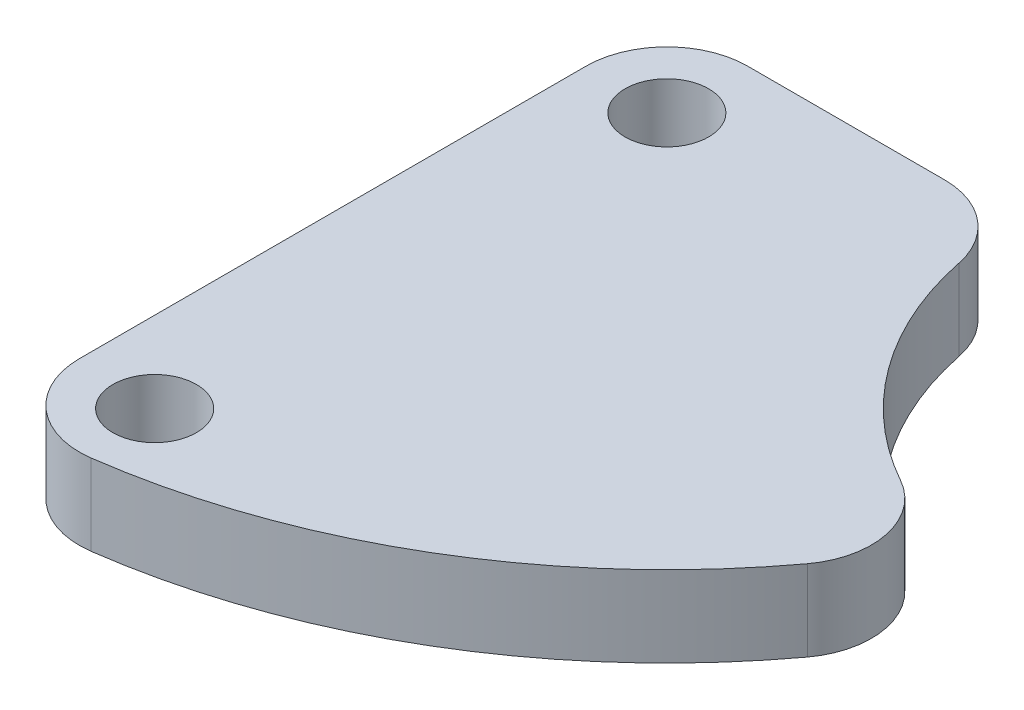
ISO-10303-21;
HEADER;
FILE_DESCRIPTION(('STEP AP214'),'2;1');
FILE_NAME('part.step','',(''),(''),'','','');
FILE_SCHEMA(('AUTOMOTIVE_DESIGN { 1 0 10303 214 1 1 1 1 }'));
ENDSEC;
DATA;
#1=APPLICATION_CONTEXT('core data for automotive mechanical design processes');
#2=APPLICATION_PROTOCOL_DEFINITION('international standard','automotive_design',2000,#1);
#3=PRODUCT_CONTEXT('',#1,'mechanical');
#4=PRODUCT('Part','Part','',(#3));
#5=PRODUCT_RELATED_PRODUCT_CATEGORY('part','',(#4));
#6=PRODUCT_DEFINITION_FORMATION('','',#4);
#7=PRODUCT_DEFINITION_CONTEXT('part definition',#1,'design');
#8=PRODUCT_DEFINITION('design','',#6,#7);
#9=PRODUCT_DEFINITION_SHAPE('','',#8);
#10=(LENGTH_UNIT() NAMED_UNIT(*) SI_UNIT(.MILLI.,.METRE.));
#11=(NAMED_UNIT(*) PLANE_ANGLE_UNIT() SI_UNIT($,.RADIAN.));
#12=(NAMED_UNIT(*) SI_UNIT($,.STERADIAN.) SOLID_ANGLE_UNIT());
#13=UNCERTAINTY_MEASURE_WITH_UNIT(LENGTH_MEASURE(1.E-05),#10,'distance_accuracy_value','');
#14=(GEOMETRIC_REPRESENTATION_CONTEXT(3) GLOBAL_UNCERTAINTY_ASSIGNED_CONTEXT((#13)) GLOBAL_UNIT_ASSIGNED_CONTEXT((#10,
#11,#12)) REPRESENTATION_CONTEXT('',''));
#15=CARTESIAN_POINT('',(0.,0.,0.));
#16=DIRECTION('',(0.,0.,1.));
#17=DIRECTION('',(1.,0.,0.));
#18=AXIS2_PLACEMENT_3D('',#15,#16,#17);
#19=CARTESIAN_POINT('',(-12.5,-3.,12.5));
#20=DIRECTION('',(-1.,0.,0.));
#21=DIRECTION('',(0.,0.,1.));
#22=AXIS2_PLACEMENT_3D('',#19,#20,#21);
#23=PLANE('',#22);
#24=DIRECTION('',(0.,0.,1.));
#25=VECTOR('',#24,1.);
#26=CARTESIAN_POINT('',(-12.5,-3.,12.5));
#27=LINE('',#26,#25);
#28=CARTESIAN_POINT('',(-12.5,-3.,-9.49999999999999));
#29=VERTEX_POINT('',#28);
#30=CARTESIAN_POINT('',(-12.5,-3.,9.29449471770337));
#31=VERTEX_POINT('',#30);
#32=EDGE_CURVE('E110',#29,#31,#27,.T.);
#33=ORIENTED_EDGE('',*,*,#32,.T.);
#34=DIRECTION('',(0.,1.,0.));
#35=VECTOR('',#34,1.);
#36=CARTESIAN_POINT('',(-12.5,-3.,9.29449471770337));
#37=LINE('',#36,#35);
#38=CARTESIAN_POINT('',(-12.5,0.,9.29449471770337));
#39=VERTEX_POINT('',#38);
#40=EDGE_CURVE('E138',#31,#39,#37,.T.);
#41=ORIENTED_EDGE('',*,*,#40,.T.);
#42=DIRECTION('',(0.,0.,1.));
#43=VECTOR('',#42,1.);
#44=CARTESIAN_POINT('',(-12.5,0.,12.5));
#45=LINE('',#44,#43);
#46=CARTESIAN_POINT('',(-12.5,0.,-9.49999999999999));
#47=VERTEX_POINT('',#46);
#48=EDGE_CURVE('E223',#47,#39,#45,.T.);
#49=ORIENTED_EDGE('',*,*,#48,.F.);
#50=DIRECTION('',(0.,1.,0.));
#51=VECTOR('',#50,1.);
#52=CARTESIAN_POINT('',(-12.5,-3.,-9.5));
#53=LINE('',#52,#51);
#54=EDGE_CURVE('E136',#47,#29,#53,.F.);
#55=ORIENTED_EDGE('',*,*,#54,.T.);
#56=EDGE_LOOP('',(#33,#41,#49,#55));
#57=FACE_BOUND('',#56,.T.);
#58=ADVANCED_FACE('F33',(#57),#23,.T.);
#59=CARTESIAN_POINT('',(-12.5,-3.,-12.5));
#60=DIRECTION('',(0.,0.,-1.));
#61=DIRECTION('',(-1.,0.,0.));
#62=AXIS2_PLACEMENT_3D('',#59,#60,#61);
#63=PLANE('',#62);
#64=DIRECTION('',(-1.,0.,0.));
#65=VECTOR('',#64,1.);
#66=CARTESIAN_POINT('',(-12.5,-3.,-12.5));
#67=LINE('',#66,#65);
#68=CARTESIAN_POINT('',(-2.19693845669907,-3.,-12.5));
#69=VERTEX_POINT('',#68);
#70=CARTESIAN_POINT('',(-9.5,-3.,-12.5));
#71=VERTEX_POINT('',#70);
#72=EDGE_CURVE('E154',#69,#71,#67,.T.);
#73=ORIENTED_EDGE('',*,*,#72,.T.);
#74=DIRECTION('',(0.,1.,0.));
#75=VECTOR('',#74,1.);
#76=CARTESIAN_POINT('',(-9.5,-3.,-12.5));
#77=LINE('',#76,#75);
#78=CARTESIAN_POINT('',(-9.5,0.,-12.5));
#79=VERTEX_POINT('',#78);
#80=EDGE_CURVE('E11',#71,#79,#77,.T.);
#81=ORIENTED_EDGE('',*,*,#80,.T.);
#82=DIRECTION('',(-1.,0.,0.));
#83=VECTOR('',#82,1.);
#84=CARTESIAN_POINT('',(-12.5,0.,-12.5));
#85=LINE('',#84,#83);
#86=CARTESIAN_POINT('',(-2.19693845669907,0.,-12.5));
#87=VERTEX_POINT('',#86);
#88=EDGE_CURVE('E217',#87,#79,#85,.T.);
#89=ORIENTED_EDGE('',*,*,#88,.F.);
#90=DIRECTION('',(0.,-1.,0.));
#91=VECTOR('',#90,1.);
#92=CARTESIAN_POINT('',(-2.19693845669907,-3.,-12.5));
#93=LINE('',#92,#91);
#94=EDGE_CURVE('E134',#87,#69,#93,.T.);
#95=ORIENTED_EDGE('',*,*,#94,.T.);
#96=EDGE_LOOP('',(#73,#81,#89,#95));
#97=FACE_BOUND('',#96,.T.);
#98=ADVANCED_FACE('F167',(#97),#63,.T.);
#99=CARTESIAN_POINT('',(0.,-3.,0.));
#100=DIRECTION('',(0.,-1.,0.));
#101=DIRECTION('',(0.,0.,-1.));
#102=AXIS2_PLACEMENT_3D('',#99,#100,#101);
#103=PLANE('',#102);
#104=CARTESIAN_POINT('',(-12.5,-3.,-12.5));
#105=DIRECTION('',(0.,-1.,0.));
#106=DIRECTION('',(0.,0.,-1.));
#107=AXIS2_PLACEMENT_3D('',#104,#105,#106);
#108=CIRCLE('',#107,25.);
#109=CARTESIAN_POINT('',(7.59090909090909,-3.,2.37801639671185));
#110=VERTEX_POINT('',#109);
#111=CARTESIAN_POINT('',(-9.09090909090909,-3.,12.2664712701175));
#112=VERTEX_POINT('',#111);
#113=EDGE_CURVE('E109',#110,#112,#108,.T.);
#114=ORIENTED_EDGE('',*,*,#113,.T.);
#115=CARTESIAN_POINT('',(-9.5,-3.,9.29449471770337));
#116=DIRECTION('',(0.,-1.,0.));
#117=DIRECTION('',(0.,0.,-1.));
#118=AXIS2_PLACEMENT_3D('',#115,#116,#117);
#119=CIRCLE('',#118,3.);
#120=EDGE_CURVE('E41',#112,#31,#119,.T.);
#121=ORIENTED_EDGE('',*,*,#120,.T.);
#122=ORIENTED_EDGE('',*,*,#32,.F.);
#123=CARTESIAN_POINT('',(-9.5,-3.,-9.5));
#124=DIRECTION('',(0.,-1.,0.));
#125=DIRECTION('',(0.,0.,-1.));
#126=AXIS2_PLACEMENT_3D('',#123,#124,#125);
#127=CIRCLE('',#126,3.);
#128=EDGE_CURVE('E48',#29,#71,#127,.T.);
#129=ORIENTED_EDGE('',*,*,#128,.T.);
#130=ORIENTED_EDGE('',*,*,#72,.F.);
#131=CARTESIAN_POINT('',(-2.19693845669907,-3.,-9.5));
#132=DIRECTION('',(0.,-1.,0.));
#133=DIRECTION('',(0.,0.,-1.));
#134=AXIS2_PLACEMENT_3D('',#131,#132,#133);
#135=CIRCLE('',#134,3.);
#136=CARTESIAN_POINT('',(0.742449234640747,-3.,-10.1));
#137=VERTEX_POINT('',#136);
#138=EDGE_CURVE('E130',#69,#137,#135,.T.);
#139=ORIENTED_EDGE('',*,*,#138,.T.);
#140=CARTESIAN_POINT('',(12.5,-3.,-12.5));
#141=DIRECTION('',(0.,1.,0.));
#142=DIRECTION('',(0.,0.,1.));
#143=AXIS2_PLACEMENT_3D('',#140,#141,#142);
#144=CIRCLE('',#143,12.);
#145=CARTESIAN_POINT('',(6.644,-3.,-2.02587645671486));
#146=VERTEX_POINT('',#145);
#147=EDGE_CURVE('E235',#137,#146,#144,.T.);
#148=ORIENTED_EDGE('',*,*,#147,.T.);
#149=CARTESIAN_POINT('',(5.18,-3.,0.592654429106426));
#150=DIRECTION('',(0.,-1.,0.));
#151=DIRECTION('',(0.,0.,-1.));
#152=AXIS2_PLACEMENT_3D('',#149,#150,#151);
#153=CIRCLE('',#152,3.);
#154=EDGE_CURVE('E132',#146,#110,#153,.T.);
#155=ORIENTED_EDGE('',*,*,#154,.T.);
#156=EDGE_LOOP('',(#114,#121,#122,#129,#130,#139,#148,#155));
#157=FACE_BOUND('',#156,.T.);
#158=CARTESIAN_POINT('',(-9.4999999999998,-3.,9.5));
#159=DIRECTION('',(0.,1.,0.));
#160=DIRECTION('',(0.,0.,1.));
#161=AXIS2_PLACEMENT_3D('',#158,#159,#160);
#162=CIRCLE('',#161,1.55);
#163=CARTESIAN_POINT('',(-9.4999999999998,-3.,11.05));
#164=VERTEX_POINT('',#163);
#165=EDGE_CURVE('E214',#164,#164,#162,.T.);
#166=ORIENTED_EDGE('',*,*,#165,.T.);
#167=EDGE_LOOP('',(#166));
#168=FACE_BOUND('',#167,.T.);
#169=CARTESIAN_POINT('',(-9.5,-3.,-9.5));
#170=DIRECTION('',(0.,1.,0.));
#171=DIRECTION('',(0.,0.,1.));
#172=AXIS2_PLACEMENT_3D('',#169,#170,#171);
#173=CIRCLE('',#172,1.55);
#174=CARTESIAN_POINT('',(-9.5,-3.,-7.95));
#175=VERTEX_POINT('',#174);
#176=EDGE_CURVE('E213',#175,#175,#173,.T.);
#177=ORIENTED_EDGE('',*,*,#176,.T.);
#178=EDGE_LOOP('',(#177));
#179=FACE_BOUND('',#178,.T.);
#180=ADVANCED_FACE('F147',(#157,#168,#179),#103,.T.);
#181=CARTESIAN_POINT('',(0.,0.,0.));
#182=DIRECTION('',(0.,-1.,0.));
#183=DIRECTION('',(0.,0.,-1.));
#184=AXIS2_PLACEMENT_3D('',#181,#182,#183);
#185=PLANE('',#184);
#186=CARTESIAN_POINT('',(-9.4999999999998,0.,9.5));
#187=DIRECTION('',(0.,1.,0.));
#188=DIRECTION('',(0.,0.,1.));
#189=AXIS2_PLACEMENT_3D('',#186,#187,#188);
#190=CIRCLE('',#189,1.55);
#191=CARTESIAN_POINT('',(-9.4999999999998,0.,11.05));
#192=VERTEX_POINT('',#191);
#193=EDGE_CURVE('E208',#192,#192,#190,.T.);
#194=ORIENTED_EDGE('',*,*,#193,.F.);
#195=EDGE_LOOP('',(#194));
#196=FACE_BOUND('',#195,.T.);
#197=CARTESIAN_POINT('',(-9.5,0.,-9.5));
#198=DIRECTION('',(0.,1.,0.));
#199=DIRECTION('',(0.,0.,1.));
#200=AXIS2_PLACEMENT_3D('',#197,#198,#199);
#201=CIRCLE('',#200,1.55);
#202=CARTESIAN_POINT('',(-9.5,0.,-7.95));
#203=VERTEX_POINT('',#202);
#204=EDGE_CURVE('E211',#203,#203,#201,.T.);
#205=ORIENTED_EDGE('',*,*,#204,.F.);
#206=EDGE_LOOP('',(#205));
#207=FACE_BOUND('',#206,.T.);
#208=ORIENTED_EDGE('',*,*,#48,.T.);
#209=CARTESIAN_POINT('',(-9.5,0.,9.29449471770337));
#210=DIRECTION('',(0.,-1.,0.));
#211=DIRECTION('',(0.,0.,-1.));
#212=AXIS2_PLACEMENT_3D('',#209,#210,#211);
#213=CIRCLE('',#212,3.);
#214=CARTESIAN_POINT('',(-9.09090909090909,0.,12.2664712701175));
#215=VERTEX_POINT('',#214);
#216=EDGE_CURVE('E107',#39,#215,#213,.F.);
#217=ORIENTED_EDGE('',*,*,#216,.T.);
#218=CARTESIAN_POINT('',(-12.5,0.,-12.5));
#219=DIRECTION('',(0.,-1.,0.));
#220=DIRECTION('',(0.,0.,-1.));
#221=AXIS2_PLACEMENT_3D('',#218,#219,#220);
#222=CIRCLE('',#221,25.);
#223=CARTESIAN_POINT('',(7.59090909090909,0.,2.37801639671185));
#224=VERTEX_POINT('',#223);
#225=EDGE_CURVE('E100',#215,#224,#222,.F.);
#226=ORIENTED_EDGE('',*,*,#225,.T.);
#227=CARTESIAN_POINT('',(5.18,0.,0.592654429106426));
#228=DIRECTION('',(0.,-1.,0.));
#229=DIRECTION('',(0.,0.,-1.));
#230=AXIS2_PLACEMENT_3D('',#227,#228,#229);
#231=CIRCLE('',#230,3.);
#232=CARTESIAN_POINT('',(6.644,0.,-2.02587645671486));
#233=VERTEX_POINT('',#232);
#234=EDGE_CURVE('E105',#224,#233,#231,.F.);
#235=ORIENTED_EDGE('',*,*,#234,.T.);
#236=CARTESIAN_POINT('',(12.5,0.,-12.5));
#237=DIRECTION('',(0.,1.,0.));
#238=DIRECTION('',(0.,0.,1.));
#239=AXIS2_PLACEMENT_3D('',#236,#237,#238);
#240=CIRCLE('',#239,12.);
#241=CARTESIAN_POINT('',(0.742449234640747,0.,-10.1));
#242=VERTEX_POINT('',#241);
#243=EDGE_CURVE('E230',#242,#233,#240,.T.);
#244=ORIENTED_EDGE('',*,*,#243,.F.);
#245=CARTESIAN_POINT('',(-2.19693845669907,0.,-9.5));
#246=DIRECTION('',(0.,-1.,0.));
#247=DIRECTION('',(0.,0.,-1.));
#248=AXIS2_PLACEMENT_3D('',#245,#246,#247);
#249=CIRCLE('',#248,3.);
#250=EDGE_CURVE('E120',#242,#87,#249,.F.);
#251=ORIENTED_EDGE('',*,*,#250,.T.);
#252=ORIENTED_EDGE('',*,*,#88,.T.);
#253=CARTESIAN_POINT('',(-9.5,0.,-9.5));
#254=DIRECTION('',(0.,-1.,0.));
#255=DIRECTION('',(0.,0.,-1.));
#256=AXIS2_PLACEMENT_3D('',#253,#254,#255);
#257=CIRCLE('',#256,3.);
#258=EDGE_CURVE('E141',#79,#47,#257,.F.);
#259=ORIENTED_EDGE('',*,*,#258,.T.);
#260=EDGE_LOOP('',(#208,#217,#226,#235,#244,#251,#252,#259));
#261=FACE_BOUND('',#260,.T.);
#262=ADVANCED_FACE('F103',(#196,#207,#261),#185,.F.);
#263=CARTESIAN_POINT('',(-9.5,-3.,-9.5));
#264=DIRECTION('',(0.,1.,0.));
#265=DIRECTION('',(0.,0.,1.));
#266=AXIS2_PLACEMENT_3D('',#263,#264,#265);
#267=CYLINDRICAL_SURFACE('',#266,1.55);
#268=ORIENTED_EDGE('',*,*,#176,.F.);
#269=EDGE_LOOP('',(#268));
#270=FACE_BOUND('',#269,.T.);
#271=ORIENTED_EDGE('',*,*,#204,.T.);
#272=EDGE_LOOP('',(#271));
#273=FACE_BOUND('',#272,.T.);
#274=ADVANCED_FACE('F194',(#270,#273),#267,.F.);
#275=CARTESIAN_POINT('',(-9.4999999999998,-3.,9.5));
#276=DIRECTION('',(0.,1.,0.));
#277=DIRECTION('',(0.,0.,1.));
#278=AXIS2_PLACEMENT_3D('',#275,#276,#277);
#279=CYLINDRICAL_SURFACE('',#278,1.55);
#280=ORIENTED_EDGE('',*,*,#165,.F.);
#281=EDGE_LOOP('',(#280));
#282=FACE_BOUND('',#281,.T.);
#283=ORIENTED_EDGE('',*,*,#193,.T.);
#284=EDGE_LOOP('',(#283));
#285=FACE_BOUND('',#284,.T.);
#286=ADVANCED_FACE('F181',(#282,#285),#279,.F.);
#287=CARTESIAN_POINT('',(-12.5,-3.,-12.5));
#288=DIRECTION('',(0.,1.,0.));
#289=DIRECTION('',(0.,0.,1.));
#290=AXIS2_PLACEMENT_3D('',#287,#288,#289);
#291=CYLINDRICAL_SURFACE('',#290,25.);
#292=ORIENTED_EDGE('',*,*,#225,.F.);
#293=DIRECTION('',(0.,1.,0.));
#294=VECTOR('',#293,1.);
#295=CARTESIAN_POINT('',(-9.09090909090909,-3.,12.2664712701175));
#296=LINE('',#295,#294);
#297=EDGE_CURVE('E56',#215,#112,#296,.F.);
#298=ORIENTED_EDGE('',*,*,#297,.T.);
#299=ORIENTED_EDGE('',*,*,#113,.F.);
#300=DIRECTION('',(0.,1.,0.));
#301=VECTOR('',#300,1.);
#302=CARTESIAN_POINT('',(7.59090909090909,-3.,2.37801639671185));
#303=LINE('',#302,#301);
#304=EDGE_CURVE('E117',#110,#224,#303,.T.);
#305=ORIENTED_EDGE('',*,*,#304,.T.);
#306=EDGE_LOOP('',(#292,#298,#299,#305));
#307=FACE_BOUND('',#306,.T.);
#308=ADVANCED_FACE('F122',(#307),#291,.T.);
#309=CARTESIAN_POINT('',(12.5,-3.,-12.5));
#310=DIRECTION('',(0.,1.,0.));
#311=DIRECTION('',(0.,0.,1.));
#312=AXIS2_PLACEMENT_3D('',#309,#310,#311);
#313=CYLINDRICAL_SURFACE('',#312,12.);
#314=ORIENTED_EDGE('',*,*,#243,.T.);
#315=DIRECTION('',(0.,1.,0.));
#316=VECTOR('',#315,1.);
#317=CARTESIAN_POINT('',(6.644,-3.,-2.02587645671486));
#318=LINE('',#317,#316);
#319=EDGE_CURVE('E118',#233,#146,#318,.F.);
#320=ORIENTED_EDGE('',*,*,#319,.T.);
#321=ORIENTED_EDGE('',*,*,#147,.F.);
#322=DIRECTION('',(0.,1.,0.));
#323=VECTOR('',#322,1.);
#324=CARTESIAN_POINT('',(0.742449234640747,-3.,-10.1));
#325=LINE('',#324,#323);
#326=EDGE_CURVE('E119',#137,#242,#325,.T.);
#327=ORIENTED_EDGE('',*,*,#326,.T.);
#328=EDGE_LOOP('',(#314,#320,#321,#327));
#329=FACE_BOUND('',#328,.T.);
#330=ADVANCED_FACE('F180',(#329),#313,.F.);
#331=CARTESIAN_POINT('',(5.18,-3.,0.592654429106426));
#332=DIRECTION('',(0.,-1.,0.));
#333=DIRECTION('',(0.,0.,-1.));
#334=AXIS2_PLACEMENT_3D('',#331,#332,#333);
#335=CYLINDRICAL_SURFACE('',#334,3.);
#336=ORIENTED_EDGE('',*,*,#154,.F.);
#337=ORIENTED_EDGE('',*,*,#319,.F.);
#338=ORIENTED_EDGE('',*,*,#234,.F.);
#339=ORIENTED_EDGE('',*,*,#304,.F.);
#340=EDGE_LOOP('',(#336,#337,#338,#339));
#341=FACE_BOUND('',#340,.T.);
#342=ADVANCED_FACE('F116',(#341),#335,.T.);
#343=CARTESIAN_POINT('',(-2.19693845669907,-3.,-9.5));
#344=DIRECTION('',(0.,1.,0.));
#345=DIRECTION('',(0.,0.,1.));
#346=AXIS2_PLACEMENT_3D('',#343,#344,#345);
#347=CYLINDRICAL_SURFACE('',#346,3.);
#348=ORIENTED_EDGE('',*,*,#138,.F.);
#349=ORIENTED_EDGE('',*,*,#94,.F.);
#350=ORIENTED_EDGE('',*,*,#250,.F.);
#351=ORIENTED_EDGE('',*,*,#326,.F.);
#352=EDGE_LOOP('',(#348,#349,#350,#351));
#353=FACE_BOUND('',#352,.T.);
#354=ADVANCED_FACE('F158',(#353),#347,.T.);
#355=CARTESIAN_POINT('',(-9.5,-3.,9.29449471770337));
#356=DIRECTION('',(0.,1.,0.));
#357=DIRECTION('',(0.,0.,1.));
#358=AXIS2_PLACEMENT_3D('',#355,#356,#357);
#359=CYLINDRICAL_SURFACE('',#358,3.);
#360=ORIENTED_EDGE('',*,*,#120,.F.);
#361=ORIENTED_EDGE('',*,*,#297,.F.);
#362=ORIENTED_EDGE('',*,*,#216,.F.);
#363=ORIENTED_EDGE('',*,*,#40,.F.);
#364=EDGE_LOOP('',(#360,#361,#362,#363));
#365=FACE_BOUND('',#364,.T.);
#366=ADVANCED_FACE('F156',(#365),#359,.T.);
#367=CARTESIAN_POINT('',(-9.5,-3.,-9.5));
#368=DIRECTION('',(0.,1.,0.));
#369=DIRECTION('',(0.,0.,1.));
#370=AXIS2_PLACEMENT_3D('',#367,#368,#369);
#371=CYLINDRICAL_SURFACE('',#370,3.);
#372=ORIENTED_EDGE('',*,*,#128,.F.);
#373=ORIENTED_EDGE('',*,*,#54,.F.);
#374=ORIENTED_EDGE('',*,*,#258,.F.);
#375=ORIENTED_EDGE('',*,*,#80,.F.);
#376=EDGE_LOOP('',(#372,#373,#374,#375));
#377=FACE_BOUND('',#376,.T.);
#378=ADVANCED_FACE('F35',(#377),#371,.T.);
#379=CLOSED_SHELL('',(#58,#98,#180,#262,#274,#286,#308,#330,#342,#354,#366,#378));
#380=MANIFOLD_SOLID_BREP('B2',#379);
#381=ADVANCED_BREP_SHAPE_REPRESENTATION('',(#18,#380),#14);
#382=SHAPE_DEFINITION_REPRESENTATION(#9,#381);
ENDSEC;
END-ISO-10303-21;
